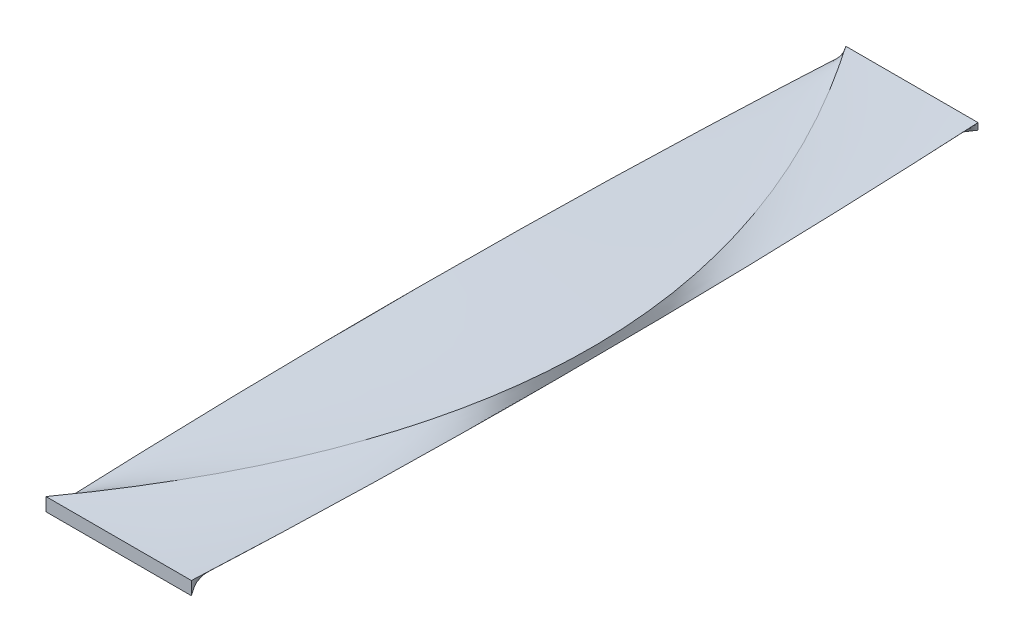
ISO-10303-21;
HEADER;
FILE_DESCRIPTION(('STEP AP214'),'2;1');
FILE_NAME('part.step','',(''),(''),'','','');
FILE_SCHEMA(('AUTOMOTIVE_DESIGN { 1 0 10303 214 1 1 1 1 }'));
ENDSEC;
DATA;
#1=APPLICATION_CONTEXT('core data for automotive mechanical design processes');
#2=APPLICATION_PROTOCOL_DEFINITION('international standard','automotive_design',2000,#1);
#3=PRODUCT_CONTEXT('',#1,'mechanical');
#4=PRODUCT('Part','Part','',(#3));
#5=PRODUCT_RELATED_PRODUCT_CATEGORY('part','',(#4));
#6=PRODUCT_DEFINITION_FORMATION('','',#4);
#7=PRODUCT_DEFINITION_CONTEXT('part definition',#1,'design');
#8=PRODUCT_DEFINITION('design','',#6,#7);
#9=PRODUCT_DEFINITION_SHAPE('','',#8);
#10=(LENGTH_UNIT() NAMED_UNIT(*) SI_UNIT(.MILLI.,.METRE.));
#11=(NAMED_UNIT(*) PLANE_ANGLE_UNIT() SI_UNIT($,.RADIAN.));
#12=(NAMED_UNIT(*) SI_UNIT($,.STERADIAN.) SOLID_ANGLE_UNIT());
#13=UNCERTAINTY_MEASURE_WITH_UNIT(LENGTH_MEASURE(1.E-05),#10,'distance_accuracy_value','');
#14=(GEOMETRIC_REPRESENTATION_CONTEXT(3) GLOBAL_UNCERTAINTY_ASSIGNED_CONTEXT((#13)) GLOBAL_UNIT_ASSIGNED_CONTEXT((#10,
#11,#12)) REPRESENTATION_CONTEXT('',''));
#15=CARTESIAN_POINT('',(0.,0.,0.));
#16=DIRECTION('',(0.,0.,1.));
#17=DIRECTION('',(1.,0.,0.));
#18=AXIS2_PLACEMENT_3D('',#15,#16,#17);
#19=CARTESIAN_POINT('',(0.,0.,30.));
#20=DIRECTION('',(0.,0.,-1.));
#21=DIRECTION('',(-1.,0.,0.));
#22=AXIS2_PLACEMENT_3D('',#19,#20,#21);
#23=PLANE('',#22);
#24=DIRECTION('',(0.,1.,0.));
#25=VECTOR('',#24,1.);
#26=CARTESIAN_POINT('',(5.,-0.25,30.));
#27=LINE('',#26,#25);
#28=CARTESIAN_POINT('',(5.,-0.25,30.));
#29=VERTEX_POINT('',#28);
#30=CARTESIAN_POINT('',(5.,0.25,30.));
#31=VERTEX_POINT('',#30);
#32=EDGE_CURVE('E105',#29,#31,#27,.T.);
#33=ORIENTED_EDGE('',*,*,#32,.F.);
#34=DIRECTION('',(1.,0.,0.));
#35=VECTOR('',#34,1.);
#36=CARTESIAN_POINT('',(-5.,-0.25,30.));
#37=LINE('',#36,#35);
#38=CARTESIAN_POINT('',(-5.,-0.25,30.));
#39=VERTEX_POINT('',#38);
#40=EDGE_CURVE('E12',#39,#29,#37,.T.);
#41=ORIENTED_EDGE('',*,*,#40,.F.);
#42=DIRECTION('',(0.,-1.,0.));
#43=VECTOR('',#42,1.);
#44=CARTESIAN_POINT('',(-5.,-0.25,30.));
#45=LINE('',#44,#43);
#46=CARTESIAN_POINT('',(-5.,0.25,30.));
#47=VERTEX_POINT('',#46);
#48=EDGE_CURVE('E60',#47,#39,#45,.T.);
#49=ORIENTED_EDGE('',*,*,#48,.F.);
#50=DIRECTION('',(-1.,0.,0.));
#51=VECTOR('',#50,1.);
#52=CARTESIAN_POINT('',(-5.,0.25,30.));
#53=LINE('',#52,#51);
#54=EDGE_CURVE('E195',#31,#47,#53,.T.);
#55=ORIENTED_EDGE('',*,*,#54,.F.);
#56=EDGE_LOOP('',(#33,#41,#49,#55));
#57=FACE_BOUND('',#56,.T.);
#58=ADVANCED_FACE('F49',(#57),#23,.T.);
#59=CARTESIAN_POINT('',(0.,0.,90.));
#60=DIRECTION('',(0.,0.,-1.));
#61=DIRECTION('',(-1.,0.,0.));
#62=AXIS2_PLACEMENT_3D('',#59,#60,#61);
#63=PLANE('',#62);
#64=DIRECTION('',(0.,1.,0.));
#65=VECTOR('',#64,1.);
#66=CARTESIAN_POINT('',(5.5,-0.5,90.));
#67=LINE('',#66,#65);
#68=CARTESIAN_POINT('',(5.5,-0.5,90.));
#69=VERTEX_POINT('',#68);
#70=CARTESIAN_POINT('',(5.5,0.5,90.));
#71=VERTEX_POINT('',#70);
#72=EDGE_CURVE('E164',#69,#71,#67,.T.);
#73=ORIENTED_EDGE('',*,*,#72,.T.);
#74=DIRECTION('',(-1.,0.,0.));
#75=VECTOR('',#74,1.);
#76=CARTESIAN_POINT('',(-5.5,0.5,90.));
#77=LINE('',#76,#75);
#78=CARTESIAN_POINT('',(-5.5,0.5,90.));
#79=VERTEX_POINT('',#78);
#80=EDGE_CURVE('E120',#71,#79,#77,.T.);
#81=ORIENTED_EDGE('',*,*,#80,.T.);
#82=DIRECTION('',(0.,-1.,0.));
#83=VECTOR('',#82,1.);
#84=CARTESIAN_POINT('',(-5.5,-0.5,90.));
#85=LINE('',#84,#83);
#86=CARTESIAN_POINT('',(-5.5,-0.5,90.));
#87=VERTEX_POINT('',#86);
#88=EDGE_CURVE('E99',#79,#87,#85,.T.);
#89=ORIENTED_EDGE('',*,*,#88,.T.);
#90=DIRECTION('',(1.,0.,0.));
#91=VECTOR('',#90,1.);
#92=CARTESIAN_POINT('',(-5.5,-0.5,90.));
#93=LINE('',#92,#91);
#94=EDGE_CURVE('E107',#87,#69,#93,.T.);
#95=ORIENTED_EDGE('',*,*,#94,.T.);
#96=EDGE_LOOP('',(#73,#81,#89,#95));
#97=FACE_BOUND('',#96,.T.);
#98=ADVANCED_FACE('F119',(#97),#63,.F.);
#99=CARTESIAN_POINT('',(-5.5,0.5,90.));
#100=CARTESIAN_POINT('',(1.58309029887452,0.458454850562741,80.0291641350577));
#101=CARTESIAN_POINT('',(8.74989688855071,0.375055504139623,60.0133209935096));
#102=CARTESIAN_POINT('',(1.91642363220786,0.291788183896074,40.0291641350577));
#103=CARTESIAN_POINT('',(-5.,0.25,30.));
#104=CARTESIAN_POINT('',(-1.83333333333333,0.5,90.));
#105=CARTESIAN_POINT('',(2.86095198140594,0.291749124786622,80.0197899487892));
#106=CARTESIAN_POINT('',(7.58337971352205,0.0417610419841079,60.0226952009285));
#107=CARTESIAN_POINT('',(2.97206309251705,0.125082458119955,40.0197899487892));
#108=CARTESIAN_POINT('',(-1.66666666666667,0.25,30.));
#109=CARTESIAN_POINT('',(1.83333333333333,0.5,90.));
#110=CARTESIAN_POINT('',(4.13881366393735,0.125043399010503,80.0104157625206));
#111=CARTESIAN_POINT('',(6.41686253849339,-0.291533420171407,60.0320694083475));
#112=CARTESIAN_POINT('',(4.02770255282624,-0.0416232676561641,40.0104157625206));
#113=CARTESIAN_POINT('',(1.66666666666667,0.25,30.));
#114=CARTESIAN_POINT('',(5.5,0.5,90.));
#115=CARTESIAN_POINT('',(5.41667534646877,-0.0416623267656165,80.0010415762521));
#116=CARTESIAN_POINT('',(5.25034536346472,-0.624827882326923,60.0414436157664));
#117=CARTESIAN_POINT('',(5.08334201313544,-0.208328993432283,40.0010415762521));
#118=CARTESIAN_POINT('',(5.,0.25,30.));
#119=B_SPLINE_SURFACE_WITH_KNOTS('',3,3,((#99,#100,#101,#102,#103),(#104,#105,#106,#107,#108),
(#109,#110,#111,#112,#113),(#114,#115,#116,#117,#118)),.UNSPECIFIED.,.F.,.F.,.F.,(4,4),(4,1,4),
(0.,1.),(0.,0.500531064330503,1.),.UNSPECIFIED.);
#120=CARTESIAN_POINT('',(5.5,0.5,90.));
#121=CARTESIAN_POINT('',(5.41667534646877,-0.0416623267656165,80.0010415762521));
#122=CARTESIAN_POINT('',(5.25034536346472,-0.624827882326923,60.0414436157664));
#123=CARTESIAN_POINT('',(5.08334201313544,-0.208328993432283,40.0010415762521));
#124=CARTESIAN_POINT('',(5.,0.25,30.));
#125=B_SPLINE_CURVE_WITH_KNOTS('',3,(#120,#121,#122,#123,#124),.UNSPECIFIED.,.F.,.F.,(4,1,4),
(0.,0.500531064330503,1.),.UNSPECIFIED.);
#126=EDGE_CURVE('E207',#71,#31,#125,.T.);
#127=CARTESIAN_POINT('',(-5.5,0.5,90.));
#128=CARTESIAN_POINT('',(1.58309029887452,0.458454850562741,80.0291641350577));
#129=CARTESIAN_POINT('',(8.74989688855071,0.375055504139623,60.0133209935096));
#130=CARTESIAN_POINT('',(1.91642363220786,0.291788183896074,40.0291641350577));
#131=CARTESIAN_POINT('',(-5.,0.25,30.));
#132=B_SPLINE_CURVE_WITH_KNOTS('',3,(#127,#128,#129,#130,#131),.UNSPECIFIED.,.F.,.F.,(4,1,4),
(0.,0.500531064330503,1.),.UNSPECIFIED.);
#133=EDGE_CURVE('E114',#47,#79,#132,.F.);
#134=ORIENTED_EDGE('',*,*,#80,.F.);
#135=ORIENTED_EDGE('',*,*,#126,.T.);
#136=ORIENTED_EDGE('',*,*,#54,.T.);
#137=ORIENTED_EDGE('',*,*,#133,.T.);
#138=EDGE_LOOP('',(#134,#135,#136,#137));
#139=FACE_BOUND('',#138,.T.);
#140=ADVANCED_FACE('F140',(#139),#119,.T.);
#141=CARTESIAN_POINT('',(5.5,0.5,90.));
#142=CARTESIAN_POINT('',(5.41667534646877,-0.0416623267656162,80.0010415762521));
#143=CARTESIAN_POINT('',(5.25034536346472,-0.624827882326923,60.0414436157664));
#144=CARTESIAN_POINT('',(5.08334201313543,-0.208328993432283,40.0010415762521));
#145=CARTESIAN_POINT('',(5.,0.25,30.));
#146=CARTESIAN_POINT('',(5.5,0.166666666666667,90.));
#147=CARTESIAN_POINT('',(3.08342013135434,-0.180593168031324,80.0104157625206));
#148=CARTESIAN_POINT('',(0.583597946126243,-0.541570422931156,60.0320694083475));
#149=CARTESIAN_POINT('',(2.750086798021,-0.23614872358688,40.0104157625206));
#150=CARTESIAN_POINT('',(5.,0.0833333333333333,30.));
#151=CARTESIAN_POINT('',(5.5,-0.166666666666667,90.));
#152=CARTESIAN_POINT('',(0.75016491623991,-0.319524009297032,80.0197899487892));
#153=CARTESIAN_POINT('',(-4.08314947121223,-0.45831296353539,60.0226952009285));
#154=CARTESIAN_POINT('',(0.416831582906576,-0.263968453741477,40.0197899487892));
#155=CARTESIAN_POINT('',(5.,-0.0833333333333333,30.));
#156=CARTESIAN_POINT('',(5.5,-0.5,90.));
#157=CARTESIAN_POINT('',(-1.58309029887452,-0.458454850562741,80.0291641350577));
#158=CARTESIAN_POINT('',(-8.74989688855071,-0.375055504139623,60.0133209935096));
#159=CARTESIAN_POINT('',(-1.91642363220785,-0.291788183896074,40.0291641350577));
#160=CARTESIAN_POINT('',(5.,-0.25,30.));
#161=B_SPLINE_SURFACE_WITH_KNOTS('',3,3,((#141,#142,#143,#144,#145),(#146,#147,#148,#149,#150),
(#151,#152,#153,#154,#155),(#156,#157,#158,#159,#160)),.UNSPECIFIED.,.F.,.F.,.F.,(4,4),(4,1,4),
(0.,1.),(0.,0.500531064330503,1.),.UNSPECIFIED.);
#162=CARTESIAN_POINT('',(5.5,-0.5,90.));
#163=CARTESIAN_POINT('',(-1.58309029887452,-0.458454850562741,80.0291641350577));
#164=CARTESIAN_POINT('',(-8.74989688855071,-0.375055504139623,60.0133209935096));
#165=CARTESIAN_POINT('',(-1.91642363220785,-0.291788183896074,40.0291641350577));
#166=CARTESIAN_POINT('',(5.,-0.25,30.));
#167=B_SPLINE_CURVE_WITH_KNOTS('',3,(#162,#163,#164,#165,#166),.UNSPECIFIED.,.F.,.F.,(4,1,4),
(0.,0.500531064330503,1.),.UNSPECIFIED.);
#168=EDGE_CURVE('E68',#69,#29,#167,.T.);
#169=ORIENTED_EDGE('',*,*,#72,.F.);
#170=ORIENTED_EDGE('',*,*,#168,.T.);
#171=ORIENTED_EDGE('',*,*,#32,.T.);
#172=ORIENTED_EDGE('',*,*,#126,.F.);
#173=EDGE_LOOP('',(#169,#170,#171,#172));
#174=FACE_BOUND('',#173,.T.);
#175=ADVANCED_FACE('F248',(#174),#161,.T.);
#176=CARTESIAN_POINT('',(-5.5,-0.5,90.));
#177=CARTESIAN_POINT('',(-5.41667534646877,0.0416623267656165,80.0010415762521));
#178=CARTESIAN_POINT('',(-5.25034536346472,0.624827882326922,60.0414436157664));
#179=CARTESIAN_POINT('',(-5.08334201313543,0.208328993432283,40.0010415762521));
#180=CARTESIAN_POINT('',(-5.,-0.25,30.));
#181=CARTESIAN_POINT('',(-5.5,-0.166666666666667,90.));
#182=CARTESIAN_POINT('',(-3.08342013135434,0.180593168031324,80.0104157625206));
#183=CARTESIAN_POINT('',(-0.583597946126243,0.541570422931156,60.0320694083475));
#184=CARTESIAN_POINT('',(-2.750086798021,0.23614872358688,40.0104157625206));
#185=CARTESIAN_POINT('',(-5.,-0.0833333333333333,30.));
#186=CARTESIAN_POINT('',(-5.5,0.166666666666667,90.));
#187=CARTESIAN_POINT('',(-0.75016491623991,0.319524009297032,80.0197899487892));
#188=CARTESIAN_POINT('',(4.08314947121223,0.45831296353539,60.0226952009285));
#189=CARTESIAN_POINT('',(-0.416831582906576,0.263968453741477,40.0197899487892));
#190=CARTESIAN_POINT('',(-5.,0.0833333333333333,30.));
#191=CARTESIAN_POINT('',(-5.5,0.5,90.));
#192=CARTESIAN_POINT('',(1.58309029887452,0.458454850562741,80.0291641350577));
#193=CARTESIAN_POINT('',(8.74989688855071,0.375055504139623,60.0133209935096));
#194=CARTESIAN_POINT('',(1.91642363220785,0.291788183896074,40.0291641350577));
#195=CARTESIAN_POINT('',(-5.,0.25,30.));
#196=B_SPLINE_SURFACE_WITH_KNOTS('',3,3,((#176,#177,#178,#179,#180),(#181,#182,#183,#184,#185),
(#186,#187,#188,#189,#190),(#191,#192,#193,#194,#195)),.UNSPECIFIED.,.F.,.F.,.F.,(4,4),(4,1,4),
(0.,1.),(0.,0.500531064330503,1.),.UNSPECIFIED.);
#197=CARTESIAN_POINT('',(-5.5,-0.5,90.));
#198=CARTESIAN_POINT('',(-5.41667534646877,0.0416623267656165,80.0010415762521));
#199=CARTESIAN_POINT('',(-5.25034536346472,0.624827882326922,60.0414436157664));
#200=CARTESIAN_POINT('',(-5.08334201313543,0.208328993432283,40.0010415762521));
#201=CARTESIAN_POINT('',(-5.,-0.25,30.));
#202=B_SPLINE_CURVE_WITH_KNOTS('',3,(#197,#198,#199,#200,#201),.UNSPECIFIED.,.F.,.F.,(4,1,4),
(0.,0.500531064330503,1.),.UNSPECIFIED.);
#203=EDGE_CURVE('E94',#87,#39,#202,.T.);
#204=ORIENTED_EDGE('',*,*,#88,.F.);
#205=ORIENTED_EDGE('',*,*,#133,.F.);
#206=ORIENTED_EDGE('',*,*,#48,.T.);
#207=ORIENTED_EDGE('',*,*,#203,.F.);
#208=EDGE_LOOP('',(#204,#205,#206,#207));
#209=FACE_BOUND('',#208,.T.);
#210=ADVANCED_FACE('F96',(#209),#196,.T.);
#211=CARTESIAN_POINT('',(5.5,-0.5,90.));
#212=CARTESIAN_POINT('',(-1.58309029887452,-0.458454850562741,80.0291641350577));
#213=CARTESIAN_POINT('',(-8.74989688855071,-0.375055504139623,60.0133209935096));
#214=CARTESIAN_POINT('',(-1.91642363220785,-0.291788183896074,40.0291641350577));
#215=CARTESIAN_POINT('',(5.,-0.25,30.));
#216=CARTESIAN_POINT('',(1.83333333333333,-0.5,90.));
#217=CARTESIAN_POINT('',(-2.86095198140593,-0.291749124786622,80.0197899487892));
#218=CARTESIAN_POINT('',(-7.58337971352204,-0.0417610419841081,60.0226952009285));
#219=CARTESIAN_POINT('',(-2.97206309251705,-0.125082458119955,40.0197899487892));
#220=CARTESIAN_POINT('',(1.66666666666667,-0.25,30.));
#221=CARTESIAN_POINT('',(-1.83333333333333,-0.5,90.));
#222=CARTESIAN_POINT('',(-4.13881366393735,-0.125043399010503,80.0104157625206));
#223=CARTESIAN_POINT('',(-6.41686253849338,0.291533420171407,60.0320694083475));
#224=CARTESIAN_POINT('',(-4.02770255282624,0.0416232676561641,40.0104157625206));
#225=CARTESIAN_POINT('',(-1.66666666666667,-0.25,30.));
#226=CARTESIAN_POINT('',(-5.5,-0.5,90.));
#227=CARTESIAN_POINT('',(-5.41667534646877,0.0416623267656165,80.0010415762521));
#228=CARTESIAN_POINT('',(-5.25034536346472,0.624827882326922,60.0414436157664));
#229=CARTESIAN_POINT('',(-5.08334201313543,0.208328993432283,40.0010415762521));
#230=CARTESIAN_POINT('',(-5.,-0.25,30.));
#231=B_SPLINE_SURFACE_WITH_KNOTS('',3,3,((#211,#212,#213,#214,#215),(#216,#217,#218,#219,#220),
(#221,#222,#223,#224,#225),(#226,#227,#228,#229,#230)),.UNSPECIFIED.,.F.,.F.,.F.,(4,4),(4,1,4),
(0.,1.),(0.,0.500531064330503,1.),.UNSPECIFIED.);
#232=ORIENTED_EDGE('',*,*,#94,.F.);
#233=ORIENTED_EDGE('',*,*,#203,.T.);
#234=ORIENTED_EDGE('',*,*,#40,.T.);
#235=ORIENTED_EDGE('',*,*,#168,.F.);
#236=EDGE_LOOP('',(#232,#233,#234,#235));
#237=FACE_BOUND('',#236,.T.);
#238=ADVANCED_FACE('F109',(#237),#231,.T.);
#239=CLOSED_SHELL('',(#58,#98,#140,#175,#210,#238));
#240=MANIFOLD_SOLID_BREP('B2',#239);
#241=ADVANCED_BREP_SHAPE_REPRESENTATION('',(#18,#240),#14);
#242=SHAPE_DEFINITION_REPRESENTATION(#9,#241);
ENDSEC;
END-ISO-10303-21;
